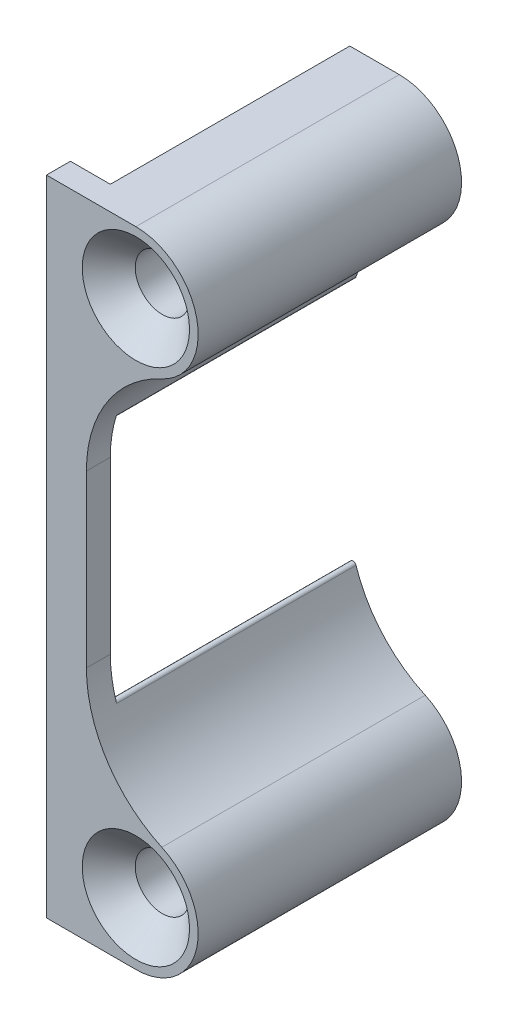
ISO-10303-21;
HEADER;
FILE_DESCRIPTION(('STEP AP214'),'2;1');
FILE_NAME('part.step','',(''),(''),'','','');
FILE_SCHEMA(('AUTOMOTIVE_DESIGN { 1 0 10303 214 1 1 1 1 }'));
ENDSEC;
DATA;
#1=APPLICATION_CONTEXT('core data for automotive mechanical design processes');
#2=APPLICATION_PROTOCOL_DEFINITION('international standard','automotive_design',2000,#1);
#3=PRODUCT_CONTEXT('',#1,'mechanical');
#4=PRODUCT('Part','Part','',(#3));
#5=PRODUCT_RELATED_PRODUCT_CATEGORY('part','',(#4));
#6=PRODUCT_DEFINITION_FORMATION('','',#4);
#7=PRODUCT_DEFINITION_CONTEXT('part definition',#1,'design');
#8=PRODUCT_DEFINITION('design','',#6,#7);
#9=PRODUCT_DEFINITION_SHAPE('','',#8);
#10=(LENGTH_UNIT() NAMED_UNIT(*) SI_UNIT(.MILLI.,.METRE.));
#11=(NAMED_UNIT(*) PLANE_ANGLE_UNIT() SI_UNIT($,.RADIAN.));
#12=(NAMED_UNIT(*) SI_UNIT($,.STERADIAN.) SOLID_ANGLE_UNIT());
#13=UNCERTAINTY_MEASURE_WITH_UNIT(LENGTH_MEASURE(1.E-05),#10,'distance_accuracy_value','');
#14=(GEOMETRIC_REPRESENTATION_CONTEXT(3) GLOBAL_UNCERTAINTY_ASSIGNED_CONTEXT((#13)) GLOBAL_UNIT_ASSIGNED_CONTEXT((#10,
#11,#12)) REPRESENTATION_CONTEXT('',''));
#15=CARTESIAN_POINT('',(0.,0.,0.));
#16=DIRECTION('',(0.,0.,1.));
#17=DIRECTION('',(1.,0.,0.));
#18=AXIS2_PLACEMENT_3D('',#15,#16,#17);
#19=CARTESIAN_POINT('',(0.,0.,0.));
#20=DIRECTION('',(0.,0.,-1.));
#21=DIRECTION('',(-1.,0.,0.));
#22=AXIS2_PLACEMENT_3D('',#19,#20,#21);
#23=PLANE('',#22);
#24=DIRECTION('',(0.,1.,0.));
#25=VECTOR('',#24,1.);
#26=CARTESIAN_POINT('',(154.9,14.9087121146357,0.));
#27=LINE('',#26,#25);
#28=CARTESIAN_POINT('',(154.9,14.9087121146357,0.));
#29=VERTEX_POINT('',#28);
#30=CARTESIAN_POINT('',(154.9,25.5912878853642,0.));
#31=VERTEX_POINT('',#30);
#32=EDGE_CURVE('E247',#29,#31,#27,.T.);
#33=ORIENTED_EDGE('',*,*,#32,.F.);
#34=CARTESIAN_POINT('',(163.,14.9087121146357,0.));
#35=DIRECTION('',(0.,0.,-1.));
#36=DIRECTION('',(-1.,0.,0.));
#37=AXIS2_PLACEMENT_3D('',#34,#35,#36);
#38=CIRCLE('',#37,8.1);
#39=CARTESIAN_POINT('',(155.290361445783,12.4244670857924,0.));
#40=VERTEX_POINT('',#39);
#41=EDGE_CURVE('E254',#40,#29,#38,.T.);
#42=ORIENTED_EDGE('',*,*,#41,.F.);
#43=CARTESIAN_POINT('',(155.1,12.3631277023641,0.));
#44=DIRECTION('',(0.,0.,-1.));
#45=DIRECTION('',(-1.,0.,0.));
#46=AXIS2_PLACEMENT_3D('',#43,#44,#45);
#47=CIRCLE('',#46,0.2);
#48=CARTESIAN_POINT('',(154.9,12.3631277023641,0.));
#49=VERTEX_POINT('',#48);
#50=EDGE_CURVE('E46',#40,#49,#47,.F.);
#51=ORIENTED_EDGE('',*,*,#50,.T.);
#52=DIRECTION('',(0.,1.,0.));
#53=VECTOR('',#52,1.);
#54=CARTESIAN_POINT('',(154.9,0.1,0.));
#55=LINE('',#54,#53);
#56=CARTESIAN_POINT('',(154.9,0.1,0.));
#57=VERTEX_POINT('',#56);
#58=EDGE_CURVE('E149',#57,#49,#55,.T.);
#59=ORIENTED_EDGE('',*,*,#58,.F.);
#60=DIRECTION('',(1.,0.,0.));
#61=VECTOR('',#60,1.);
#62=CARTESIAN_POINT('',(0.1,0.1,0.));
#63=LINE('',#62,#61);
#64=CARTESIAN_POINT('',(152.4,0.1,0.));
#65=VERTEX_POINT('',#64);
#66=EDGE_CURVE('E161',#65,#57,#63,.T.);
#67=ORIENTED_EDGE('',*,*,#66,.F.);
#68=DIRECTION('',(0.,-1.,0.));
#69=VECTOR('',#68,1.);
#70=CARTESIAN_POINT('',(152.4,40.4,0.));
#71=LINE('',#70,#69);
#72=CARTESIAN_POINT('',(152.4,40.4,0.));
#73=VERTEX_POINT('',#72);
#74=EDGE_CURVE('E298',#73,#65,#71,.T.);
#75=ORIENTED_EDGE('',*,*,#74,.F.);
#76=DIRECTION('',(-1.,0.,0.));
#77=VECTOR('',#76,1.);
#78=CARTESIAN_POINT('',(158.,40.4,0.));
#79=LINE('',#78,#77);
#80=CARTESIAN_POINT('',(154.9,40.4,0.));
#81=VERTEX_POINT('',#80);
#82=EDGE_CURVE('E262',#81,#73,#79,.T.);
#83=ORIENTED_EDGE('',*,*,#82,.F.);
#84=DIRECTION('',(0.,1.,0.));
#85=VECTOR('',#84,1.);
#86=CARTESIAN_POINT('',(154.9,40.4,0.));
#87=LINE('',#86,#85);
#88=CARTESIAN_POINT('',(154.9,28.1368722976358,0.));
#89=VERTEX_POINT('',#88);
#90=EDGE_CURVE('E178',#89,#81,#87,.T.);
#91=ORIENTED_EDGE('',*,*,#90,.F.);
#92=CARTESIAN_POINT('',(155.1,28.1368722976358,0.));
#93=DIRECTION('',(0.,0.,-1.));
#94=DIRECTION('',(-1.,0.,0.));
#95=AXIS2_PLACEMENT_3D('',#92,#93,#94);
#96=CIRCLE('',#95,0.2);
#97=CARTESIAN_POINT('',(155.290361445783,28.0755329142076,0.));
#98=VERTEX_POINT('',#97);
#99=EDGE_CURVE('E11',#89,#98,#96,.F.);
#100=ORIENTED_EDGE('',*,*,#99,.T.);
#101=CARTESIAN_POINT('',(163.,25.5912878853642,0.));
#102=DIRECTION('',(0.,0.,-1.));
#103=DIRECTION('',(-1.,0.,0.));
#104=AXIS2_PLACEMENT_3D('',#101,#102,#103);
#105=CIRCLE('',#104,8.1);
#106=EDGE_CURVE('E53',#31,#98,#105,.T.);
#107=ORIENTED_EDGE('',*,*,#106,.F.);
#108=EDGE_LOOP('',(#33,#42,#51,#59,#67,#75,#83,#91,#100,#107));
#109=FACE_BOUND('',#108,.T.);
#110=ADVANCED_FACE('F37',(#109),#23,.T.);
#111=CARTESIAN_POINT('',(158.,4.,0.));
#112=DIRECTION('',(0.,0.,1.));
#113=DIRECTION('',(1.,0.,0.));
#114=AXIS2_PLACEMENT_3D('',#111,#112,#113);
#115=CYLINDRICAL_SURFACE('',#114,3.9);
#116=CARTESIAN_POINT('',(158.,4.,1.5));
#117=DIRECTION('',(0.,0.,1.));
#118=DIRECTION('',(1.,0.,0.));
#119=AXIS2_PLACEMENT_3D('',#116,#117,#118);
#120=CIRCLE('',#119,3.9);
#121=CARTESIAN_POINT('',(158.,0.0999999999999998,1.5));
#122=VERTEX_POINT('',#121);
#123=CARTESIAN_POINT('',(159.625,7.5453314372566,1.5));
#124=VERTEX_POINT('',#123);
#125=EDGE_CURVE('E272',#122,#124,#120,.T.);
#126=ORIENTED_EDGE('',*,*,#125,.F.);
#127=DIRECTION('',(0.,0.,1.));
#128=VECTOR('',#127,1.);
#129=CARTESIAN_POINT('',(158.,0.0999999999999998,0.));
#130=LINE('',#129,#128);
#131=CARTESIAN_POINT('',(158.,0.0999999999999985,-15.));
#132=VERTEX_POINT('',#131);
#133=EDGE_CURVE('E165',#132,#122,#130,.T.);
#134=ORIENTED_EDGE('',*,*,#133,.F.);
#135=CARTESIAN_POINT('',(158.,4.,-15.));
#136=DIRECTION('',(0.,0.,-1.));
#137=DIRECTION('',(-1.,0.,0.));
#138=AXIS2_PLACEMENT_3D('',#135,#136,#137);
#139=CIRCLE('',#138,3.9);
#140=CARTESIAN_POINT('',(159.625,7.5453314372566,-15.));
#141=VERTEX_POINT('',#140);
#142=EDGE_CURVE('E142',#141,#132,#139,.T.);
#143=ORIENTED_EDGE('',*,*,#142,.F.);
#144=DIRECTION('',(0.,0.,1.));
#145=VECTOR('',#144,1.);
#146=CARTESIAN_POINT('',(159.625,7.54533143725661,0.));
#147=LINE('',#146,#145);
#148=EDGE_CURVE('E152',#141,#124,#147,.T.);
#149=ORIENTED_EDGE('',*,*,#148,.T.);
#150=EDGE_LOOP('',(#126,#134,#143,#149));
#151=FACE_BOUND('',#150,.T.);
#152=ADVANCED_FACE('F163',(#151),#115,.T.);
#153=CARTESIAN_POINT('',(0.1,0.1,0.));
#154=DIRECTION('',(0.,-1.,0.));
#155=DIRECTION('',(1.,0.,0.));
#156=AXIS2_PLACEMENT_3D('',#153,#154,#155);
#157=PLANE('',#156);
#158=DIRECTION('',(0.,0.,-1.));
#159=VECTOR('',#158,1.);
#160=CARTESIAN_POINT('',(152.4,0.1,1.5));
#161=LINE('',#160,#159);
#162=CARTESIAN_POINT('',(152.4,0.0999999999999998,1.5));
#163=VERTEX_POINT('',#162);
#164=EDGE_CURVE('E274',#163,#65,#161,.T.);
#165=ORIENTED_EDGE('',*,*,#164,.T.);
#166=ORIENTED_EDGE('',*,*,#66,.T.);
#167=DIRECTION('',(0.,0.,1.));
#168=VECTOR('',#167,1.);
#169=CARTESIAN_POINT('',(154.9,0.1,-15.));
#170=LINE('',#169,#168);
#171=CARTESIAN_POINT('',(154.9,0.1,-15.));
#172=VERTEX_POINT('',#171);
#173=EDGE_CURVE('E173',#172,#57,#170,.T.);
#174=ORIENTED_EDGE('',*,*,#173,.F.);
#175=DIRECTION('',(-1.,0.,0.));
#176=VECTOR('',#175,1.);
#177=CARTESIAN_POINT('',(158.,0.0999999999999985,-15.));
#178=LINE('',#177,#176);
#179=EDGE_CURVE('E166',#132,#172,#178,.T.);
#180=ORIENTED_EDGE('',*,*,#179,.F.);
#181=ORIENTED_EDGE('',*,*,#133,.T.);
#182=DIRECTION('',(1.,0.,0.));
#183=VECTOR('',#182,1.);
#184=CARTESIAN_POINT('',(0.1,0.1,1.5));
#185=LINE('',#184,#183);
#186=EDGE_CURVE('E245',#163,#122,#185,.T.);
#187=ORIENTED_EDGE('',*,*,#186,.F.);
#188=EDGE_LOOP('',(#165,#166,#174,#180,#181,#187));
#189=FACE_BOUND('',#188,.T.);
#190=ADVANCED_FACE('F309',(#189),#157,.T.);
#191=CARTESIAN_POINT('',(158.,40.4,0.));
#192=DIRECTION('',(0.,1.,0.));
#193=DIRECTION('',(-1.,0.,0.));
#194=AXIS2_PLACEMENT_3D('',#191,#192,#193);
#195=PLANE('',#194);
#196=DIRECTION('',(0.,0.,-1.));
#197=VECTOR('',#196,1.);
#198=CARTESIAN_POINT('',(152.4,40.4,1.5));
#199=LINE('',#198,#197);
#200=CARTESIAN_POINT('',(152.4,40.4,1.5));
#201=VERTEX_POINT('',#200);
#202=EDGE_CURVE('E303',#201,#73,#199,.T.);
#203=ORIENTED_EDGE('',*,*,#202,.F.);
#204=DIRECTION('',(-1.,0.,0.));
#205=VECTOR('',#204,1.);
#206=CARTESIAN_POINT('',(158.,40.4,1.5));
#207=LINE('',#206,#205);
#208=CARTESIAN_POINT('',(158.,40.4,1.5));
#209=VERTEX_POINT('',#208);
#210=EDGE_CURVE('E238',#209,#201,#207,.T.);
#211=ORIENTED_EDGE('',*,*,#210,.F.);
#212=DIRECTION('',(0.,0.,1.));
#213=VECTOR('',#212,1.);
#214=CARTESIAN_POINT('',(158.,40.4,0.));
#215=LINE('',#214,#213);
#216=CARTESIAN_POINT('',(158.,40.4,-15.));
#217=VERTEX_POINT('',#216);
#218=EDGE_CURVE('E255',#217,#209,#215,.T.);
#219=ORIENTED_EDGE('',*,*,#218,.F.);
#220=DIRECTION('',(1.,0.,0.));
#221=VECTOR('',#220,1.);
#222=CARTESIAN_POINT('',(154.9,40.4,-15.));
#223=LINE('',#222,#221);
#224=CARTESIAN_POINT('',(154.9,40.4,-15.));
#225=VERTEX_POINT('',#224);
#226=EDGE_CURVE('E184',#225,#217,#223,.T.);
#227=ORIENTED_EDGE('',*,*,#226,.F.);
#228=DIRECTION('',(0.,0.,1.));
#229=VECTOR('',#228,1.);
#230=CARTESIAN_POINT('',(154.9,40.4,-15.));
#231=LINE('',#230,#229);
#232=EDGE_CURVE('E190',#225,#81,#231,.T.);
#233=ORIENTED_EDGE('',*,*,#232,.T.);
#234=ORIENTED_EDGE('',*,*,#82,.T.);
#235=EDGE_LOOP('',(#203,#211,#219,#227,#233,#234));
#236=FACE_BOUND('',#235,.T.);
#237=ADVANCED_FACE('F287',(#236),#195,.T.);
#238=CARTESIAN_POINT('',(158.,36.5,0.));
#239=DIRECTION('',(0.,0.,1.));
#240=DIRECTION('',(1.,0.,0.));
#241=AXIS2_PLACEMENT_3D('',#238,#239,#240);
#242=CYLINDRICAL_SURFACE('',#241,3.90000000000002);
#243=CARTESIAN_POINT('',(158.,36.5,1.5));
#244=DIRECTION('',(0.,0.,1.));
#245=DIRECTION('',(1.,0.,0.));
#246=AXIS2_PLACEMENT_3D('',#243,#244,#245);
#247=CIRCLE('',#246,3.90000000000002);
#248=CARTESIAN_POINT('',(159.625,32.9546685627433,1.5));
#249=VERTEX_POINT('',#248);
#250=EDGE_CURVE('E242',#249,#209,#247,.T.);
#251=ORIENTED_EDGE('',*,*,#250,.F.);
#252=DIRECTION('',(0.,0.,1.));
#253=VECTOR('',#252,1.);
#254=CARTESIAN_POINT('',(159.625,32.9546685627433,0.));
#255=LINE('',#254,#253);
#256=CARTESIAN_POINT('',(159.625,32.9546685627433,-15.));
#257=VERTEX_POINT('',#256);
#258=EDGE_CURVE('E257',#257,#249,#255,.T.);
#259=ORIENTED_EDGE('',*,*,#258,.F.);
#260=CARTESIAN_POINT('',(158.,36.5,-15.));
#261=DIRECTION('',(0.,0.,-1.));
#262=DIRECTION('',(-1.,0.,0.));
#263=AXIS2_PLACEMENT_3D('',#260,#261,#262);
#264=CIRCLE('',#263,3.90000000000003);
#265=EDGE_CURVE('E187',#217,#257,#264,.T.);
#266=ORIENTED_EDGE('',*,*,#265,.F.);
#267=ORIENTED_EDGE('',*,*,#218,.T.);
#268=EDGE_LOOP('',(#251,#259,#266,#267));
#269=FACE_BOUND('',#268,.T.);
#270=ADVANCED_FACE('F285',(#269),#242,.T.);
#271=CARTESIAN_POINT('',(163.,25.5912878853642,0.));
#272=DIRECTION('',(0.,0.,1.));
#273=DIRECTION('',(1.,0.,0.));
#274=AXIS2_PLACEMENT_3D('',#271,#272,#273);
#275=CYLINDRICAL_SURFACE('',#274,8.1);
#276=DIRECTION('',(0.,0.,1.));
#277=VECTOR('',#276,1.);
#278=CARTESIAN_POINT('',(154.9,25.5912878853642,0.));
#279=LINE('',#278,#277);
#280=CARTESIAN_POINT('',(154.9,25.5912878853642,1.5));
#281=VERTEX_POINT('',#280);
#282=EDGE_CURVE('E259',#31,#281,#279,.T.);
#283=ORIENTED_EDGE('',*,*,#282,.F.);
#284=ORIENTED_EDGE('',*,*,#106,.T.);
#285=DIRECTION('',(0.,0.,1.));
#286=VECTOR('',#285,1.);
#287=CARTESIAN_POINT('',(155.290361445783,28.0755329142076,0.));
#288=LINE('',#287,#286);
#289=CARTESIAN_POINT('',(155.290361445783,28.0755329142076,-15.));
#290=VERTEX_POINT('',#289);
#291=EDGE_CURVE('E202',#98,#290,#288,.F.);
#292=ORIENTED_EDGE('',*,*,#291,.T.);
#293=CARTESIAN_POINT('',(163.,25.5912878853642,-15.));
#294=DIRECTION('',(0.,0.,1.));
#295=DIRECTION('',(-1.,0.,0.));
#296=AXIS2_PLACEMENT_3D('',#293,#294,#295);
#297=CIRCLE('',#296,8.1);
#298=EDGE_CURVE('E179',#257,#290,#297,.T.);
#299=ORIENTED_EDGE('',*,*,#298,.F.);
#300=ORIENTED_EDGE('',*,*,#258,.T.);
#301=CARTESIAN_POINT('',(163.,25.5912878853642,1.5));
#302=DIRECTION('',(0.,0.,-1.));
#303=DIRECTION('',(1.,0.,0.));
#304=AXIS2_PLACEMENT_3D('',#301,#302,#303);
#305=CIRCLE('',#304,8.1);
#306=EDGE_CURVE('E249',#281,#249,#305,.T.);
#307=ORIENTED_EDGE('',*,*,#306,.F.);
#308=EDGE_LOOP('',(#283,#284,#292,#299,#300,#307));
#309=FACE_BOUND('',#308,.T.);
#310=ADVANCED_FACE('F280',(#309),#275,.F.);
#311=CARTESIAN_POINT('',(154.9,14.9087121146357,0.));
#312=DIRECTION('',(1.,0.,0.));
#313=DIRECTION('',(0.,0.,-1.));
#314=AXIS2_PLACEMENT_3D('',#311,#312,#313);
#315=PLANE('',#314);
#316=DIRECTION('',(0.,1.,0.));
#317=VECTOR('',#316,1.);
#318=CARTESIAN_POINT('',(154.9,14.9087121146357,1.5));
#319=LINE('',#318,#317);
#320=CARTESIAN_POINT('',(154.9,14.9087121146357,1.5));
#321=VERTEX_POINT('',#320);
#322=EDGE_CURVE('E276',#321,#281,#319,.T.);
#323=ORIENTED_EDGE('',*,*,#322,.F.);
#324=DIRECTION('',(0.,0.,1.));
#325=VECTOR('',#324,1.);
#326=CARTESIAN_POINT('',(154.9,14.9087121146357,0.));
#327=LINE('',#326,#325);
#328=EDGE_CURVE('E160',#29,#321,#327,.T.);
#329=ORIENTED_EDGE('',*,*,#328,.F.);
#330=ORIENTED_EDGE('',*,*,#32,.T.);
#331=ORIENTED_EDGE('',*,*,#282,.T.);
#332=EDGE_LOOP('',(#323,#329,#330,#331));
#333=FACE_BOUND('',#332,.T.);
#334=ADVANCED_FACE('F323',(#333),#315,.T.);
#335=CARTESIAN_POINT('',(163.,14.9087121146357,0.));
#336=DIRECTION('',(0.,0.,1.));
#337=DIRECTION('',(1.,0.,0.));
#338=AXIS2_PLACEMENT_3D('',#335,#336,#337);
#339=CYLINDRICAL_SURFACE('',#338,8.1);
#340=CARTESIAN_POINT('',(163.,14.9087121146357,-15.));
#341=DIRECTION('',(0.,0.,1.));
#342=DIRECTION('',(-1.,0.,0.));
#343=AXIS2_PLACEMENT_3D('',#340,#341,#342);
#344=CIRCLE('',#343,8.1);
#345=CARTESIAN_POINT('',(155.290361445783,12.4244670857924,-15.));
#346=VERTEX_POINT('',#345);
#347=EDGE_CURVE('E137',#346,#141,#344,.T.);
#348=ORIENTED_EDGE('',*,*,#347,.F.);
#349=DIRECTION('',(0.,0.,1.));
#350=VECTOR('',#349,1.);
#351=CARTESIAN_POINT('',(155.290361445783,12.4244670857924,0.));
#352=LINE('',#351,#350);
#353=EDGE_CURVE('E316',#346,#40,#352,.T.);
#354=ORIENTED_EDGE('',*,*,#353,.T.);
#355=ORIENTED_EDGE('',*,*,#41,.T.);
#356=ORIENTED_EDGE('',*,*,#328,.T.);
#357=CARTESIAN_POINT('',(163.,14.9087121146357,1.5));
#358=DIRECTION('',(0.,0.,-1.));
#359=DIRECTION('',(1.,0.,0.));
#360=AXIS2_PLACEMENT_3D('',#357,#358,#359);
#361=CIRCLE('',#360,8.1);
#362=EDGE_CURVE('E156',#124,#321,#361,.T.);
#363=ORIENTED_EDGE('',*,*,#362,.F.);
#364=ORIENTED_EDGE('',*,*,#148,.F.);
#365=EDGE_LOOP('',(#348,#354,#355,#356,#363,#364));
#366=FACE_BOUND('',#365,.T.);
#367=ADVANCED_FACE('F153',(#366),#339,.F.);
#368=CARTESIAN_POINT('',(0.,0.,1.5));
#369=DIRECTION('',(0.,0.,-1.));
#370=DIRECTION('',(-1.,0.,0.));
#371=AXIS2_PLACEMENT_3D('',#368,#369,#370);
#372=PLANE('',#371);
#373=CARTESIAN_POINT('',(158.,36.5,1.5));
#374=DIRECTION('',(0.,0.,1.));
#375=DIRECTION('',(1.,0.,0.));
#376=AXIS2_PLACEMENT_3D('',#373,#374,#375);
#377=CIRCLE('',#376,3.36);
#378=CARTESIAN_POINT('',(161.36,36.5,1.5));
#379=VERTEX_POINT('',#378);
#380=EDGE_CURVE('E221',#379,#379,#377,.T.);
#381=ORIENTED_EDGE('',*,*,#380,.F.);
#382=EDGE_LOOP('',(#381));
#383=FACE_BOUND('',#382,.T.);
#384=CARTESIAN_POINT('',(158.,4.,1.5));
#385=DIRECTION('',(0.,0.,1.));
#386=DIRECTION('',(1.,0.,0.));
#387=AXIS2_PLACEMENT_3D('',#384,#385,#386);
#388=CIRCLE('',#387,3.36);
#389=CARTESIAN_POINT('',(161.36,4.,1.5));
#390=VERTEX_POINT('',#389);
#391=EDGE_CURVE('E212',#390,#390,#388,.T.);
#392=ORIENTED_EDGE('',*,*,#391,.F.);
#393=EDGE_LOOP('',(#392));
#394=FACE_BOUND('',#393,.T.);
#395=ORIENTED_EDGE('',*,*,#210,.T.);
#396=DIRECTION('',(0.,-1.,0.));
#397=VECTOR('',#396,1.);
#398=CARTESIAN_POINT('',(152.4,40.4,1.5));
#399=LINE('',#398,#397);
#400=EDGE_CURVE('E193',#201,#163,#399,.T.);
#401=ORIENTED_EDGE('',*,*,#400,.T.);
#402=ORIENTED_EDGE('',*,*,#186,.T.);
#403=ORIENTED_EDGE('',*,*,#125,.T.);
#404=ORIENTED_EDGE('',*,*,#362,.T.);
#405=ORIENTED_EDGE('',*,*,#322,.T.);
#406=ORIENTED_EDGE('',*,*,#306,.T.);
#407=ORIENTED_EDGE('',*,*,#250,.T.);
#408=EDGE_LOOP('',(#395,#401,#402,#403,#404,#405,#406,#407));
#409=FACE_BOUND('',#408,.T.);
#410=ADVANCED_FACE('F227',(#383,#394,#409),#372,.F.);
#411=CARTESIAN_POINT('',(152.4,40.4,1.5));
#412=DIRECTION('',(1.,0.,0.));
#413=DIRECTION('',(0.,0.,-1.));
#414=AXIS2_PLACEMENT_3D('',#411,#412,#413);
#415=PLANE('',#414);
#416=ORIENTED_EDGE('',*,*,#74,.T.);
#417=ORIENTED_EDGE('',*,*,#164,.F.);
#418=ORIENTED_EDGE('',*,*,#400,.F.);
#419=ORIENTED_EDGE('',*,*,#202,.T.);
#420=EDGE_LOOP('',(#416,#417,#418,#419));
#421=FACE_BOUND('',#420,.T.);
#422=ADVANCED_FACE('F230',(#421),#415,.F.);
#423=CARTESIAN_POINT('',(154.9,40.4,-15.));
#424=DIRECTION('',(1.,0.,0.));
#425=DIRECTION('',(0.,0.,-1.));
#426=AXIS2_PLACEMENT_3D('',#423,#424,#425);
#427=PLANE('',#426);
#428=DIRECTION('',(0.,1.,0.));
#429=VECTOR('',#428,1.);
#430=CARTESIAN_POINT('',(154.9,40.4,-15.));
#431=LINE('',#430,#429);
#432=CARTESIAN_POINT('',(154.9,28.1368722976358,-15.));
#433=VERTEX_POINT('',#432);
#434=EDGE_CURVE('E182',#433,#225,#431,.T.);
#435=ORIENTED_EDGE('',*,*,#434,.F.);
#436=DIRECTION('',(0.,0.,-1.));
#437=VECTOR('',#436,1.);
#438=CARTESIAN_POINT('',(154.9,28.1368722976358,0.));
#439=LINE('',#438,#437);
#440=EDGE_CURVE('E199',#433,#89,#439,.F.);
#441=ORIENTED_EDGE('',*,*,#440,.T.);
#442=ORIENTED_EDGE('',*,*,#90,.T.);
#443=ORIENTED_EDGE('',*,*,#232,.F.);
#444=EDGE_LOOP('',(#435,#441,#442,#443));
#445=FACE_BOUND('',#444,.T.);
#446=ADVANCED_FACE('F296',(#445),#427,.F.);
#447=CARTESIAN_POINT('',(163.,25.5912878853642,-15.));
#448=DIRECTION('',(0.,0.,-1.));
#449=DIRECTION('',(-1.,0.,0.));
#450=AXIS2_PLACEMENT_3D('',#447,#448,#449);
#451=PLANE('',#450);
#452=CARTESIAN_POINT('',(158.,36.5,-15.));
#453=DIRECTION('',(0.,0.,-1.));
#454=DIRECTION('',(-1.,0.,0.));
#455=AXIS2_PLACEMENT_3D('',#452,#453,#454);
#456=CIRCLE('',#455,1.70000000000001);
#457=CARTESIAN_POINT('',(156.3,36.5,-15.));
#458=VERTEX_POINT('',#457);
#459=EDGE_CURVE('E41',#458,#458,#456,.T.);
#460=ORIENTED_EDGE('',*,*,#459,.F.);
#461=EDGE_LOOP('',(#460));
#462=FACE_BOUND('',#461,.T.);
#463=ORIENTED_EDGE('',*,*,#298,.T.);
#464=CARTESIAN_POINT('',(155.1,28.1368722976358,-15.));
#465=DIRECTION('',(0.,0.,-1.));
#466=DIRECTION('',(-1.,0.,0.));
#467=AXIS2_PLACEMENT_3D('',#464,#465,#466);
#468=CIRCLE('',#467,0.2);
#469=EDGE_CURVE('E205',#290,#433,#468,.T.);
#470=ORIENTED_EDGE('',*,*,#469,.T.);
#471=ORIENTED_EDGE('',*,*,#434,.T.);
#472=ORIENTED_EDGE('',*,*,#226,.T.);
#473=ORIENTED_EDGE('',*,*,#265,.T.);
#474=EDGE_LOOP('',(#463,#470,#471,#472,#473));
#475=FACE_BOUND('',#474,.T.);
#476=ADVANCED_FACE('F290',(#462,#475),#451,.T.);
#477=CARTESIAN_POINT('',(154.9,0.1,-15.));
#478=DIRECTION('',(1.,0.,0.));
#479=DIRECTION('',(0.,0.,-1.));
#480=AXIS2_PLACEMENT_3D('',#477,#478,#479);
#481=PLANE('',#480);
#482=ORIENTED_EDGE('',*,*,#58,.T.);
#483=DIRECTION('',(0.,0.,-1.));
#484=VECTOR('',#483,1.);
#485=CARTESIAN_POINT('',(154.9,12.3631277023641,-15.));
#486=LINE('',#485,#484);
#487=CARTESIAN_POINT('',(154.9,12.3631277023641,-15.));
#488=VERTEX_POINT('',#487);
#489=EDGE_CURVE('E315',#49,#488,#486,.T.);
#490=ORIENTED_EDGE('',*,*,#489,.T.);
#491=DIRECTION('',(0.,1.,0.));
#492=VECTOR('',#491,1.);
#493=CARTESIAN_POINT('',(154.9,0.1,-15.));
#494=LINE('',#493,#492);
#495=EDGE_CURVE('E168',#172,#488,#494,.T.);
#496=ORIENTED_EDGE('',*,*,#495,.F.);
#497=ORIENTED_EDGE('',*,*,#173,.T.);
#498=EDGE_LOOP('',(#482,#490,#496,#497));
#499=FACE_BOUND('',#498,.T.);
#500=ADVANCED_FACE('F345',(#499),#481,.F.);
#501=CARTESIAN_POINT('',(163.,14.9087121146357,-15.));
#502=DIRECTION('',(0.,0.,-1.));
#503=DIRECTION('',(-1.,0.,0.));
#504=AXIS2_PLACEMENT_3D('',#501,#502,#503);
#505=PLANE('',#504);
#506=CARTESIAN_POINT('',(158.,4.,-15.));
#507=DIRECTION('',(0.,0.,-1.));
#508=DIRECTION('',(-1.,0.,0.));
#509=AXIS2_PLACEMENT_3D('',#506,#507,#508);
#510=CIRCLE('',#509,1.70000000000001);
#511=CARTESIAN_POINT('',(156.3,4.,-15.));
#512=VERTEX_POINT('',#511);
#513=EDGE_CURVE('E176',#512,#512,#510,.T.);
#514=ORIENTED_EDGE('',*,*,#513,.F.);
#515=EDGE_LOOP('',(#514));
#516=FACE_BOUND('',#515,.T.);
#517=ORIENTED_EDGE('',*,*,#495,.T.);
#518=CARTESIAN_POINT('',(155.1,12.3631277023641,-15.));
#519=DIRECTION('',(0.,0.,-1.));
#520=DIRECTION('',(-1.,0.,0.));
#521=AXIS2_PLACEMENT_3D('',#518,#519,#520);
#522=CIRCLE('',#521,0.2);
#523=EDGE_CURVE('E145',#488,#346,#522,.T.);
#524=ORIENTED_EDGE('',*,*,#523,.T.);
#525=ORIENTED_EDGE('',*,*,#347,.T.);
#526=ORIENTED_EDGE('',*,*,#142,.T.);
#527=ORIENTED_EDGE('',*,*,#179,.T.);
#528=EDGE_LOOP('',(#517,#524,#525,#526,#527));
#529=FACE_BOUND('',#528,.T.);
#530=ADVANCED_FACE('F140',(#516,#529),#505,.T.);
#531=CARTESIAN_POINT('',(155.1,12.3631277023641,0.));
#532=DIRECTION('',(0.,0.,1.));
#533=DIRECTION('',(1.,0.,0.));
#534=AXIS2_PLACEMENT_3D('',#531,#532,#533);
#535=CYLINDRICAL_SURFACE('',#534,0.2);
#536=ORIENTED_EDGE('',*,*,#523,.F.);
#537=ORIENTED_EDGE('',*,*,#489,.F.);
#538=ORIENTED_EDGE('',*,*,#50,.F.);
#539=ORIENTED_EDGE('',*,*,#353,.F.);
#540=EDGE_LOOP('',(#536,#537,#538,#539));
#541=FACE_BOUND('',#540,.T.);
#542=ADVANCED_FACE('F314',(#541),#535,.T.);
#543=CARTESIAN_POINT('',(155.1,28.1368722976358,0.));
#544=DIRECTION('',(0.,0.,1.));
#545=DIRECTION('',(1.,0.,0.));
#546=AXIS2_PLACEMENT_3D('',#543,#544,#545);
#547=CYLINDRICAL_SURFACE('',#546,0.2);
#548=ORIENTED_EDGE('',*,*,#469,.F.);
#549=ORIENTED_EDGE('',*,*,#291,.F.);
#550=ORIENTED_EDGE('',*,*,#99,.F.);
#551=ORIENTED_EDGE('',*,*,#440,.F.);
#552=EDGE_LOOP('',(#548,#549,#550,#551));
#553=FACE_BOUND('',#552,.T.);
#554=ADVANCED_FACE('F39',(#553),#547,.T.);
#555=CARTESIAN_POINT('',(158.,4.,1.5));
#556=DIRECTION('',(0.,0.,1.));
#557=DIRECTION('',(1.,0.,0.));
#558=AXIS2_PLACEMENT_3D('',#555,#556,#557);
#559=CYLINDRICAL_SURFACE('',#558,1.70000000000001);
#560=ORIENTED_EDGE('',*,*,#513,.T.);
#561=EDGE_LOOP('',(#560));
#562=FACE_BOUND('',#561,.T.);
#563=CARTESIAN_POINT('',(158.,4.,-0.16));
#564=DIRECTION('',(0.,0.,1.));
#565=DIRECTION('',(1.,0.,0.));
#566=AXIS2_PLACEMENT_3D('',#563,#564,#565);
#567=CIRCLE('',#566,1.70000000000001);
#568=CARTESIAN_POINT('',(159.7,4.,-0.16));
#569=VERTEX_POINT('',#568);
#570=EDGE_CURVE('E208',#569,#569,#567,.T.);
#571=ORIENTED_EDGE('',*,*,#570,.T.);
#572=EDGE_LOOP('',(#571));
#573=FACE_BOUND('',#572,.T.);
#574=ADVANCED_FACE('F343',(#562,#573),#559,.F.);
#575=CARTESIAN_POINT('',(158.,4.,1.5));
#576=DIRECTION('',(0.,0.,1.));
#577=DIRECTION('',(1.,0.,0.));
#578=AXIS2_PLACEMENT_3D('',#575,#576,#577);
#579=CONICAL_SURFACE('',#578,3.36,0.785398163397447);
#580=ORIENTED_EDGE('',*,*,#570,.F.);
#581=EDGE_LOOP('',(#580));
#582=FACE_BOUND('',#581,.T.);
#583=ORIENTED_EDGE('',*,*,#391,.T.);
#584=EDGE_LOOP('',(#583));
#585=FACE_BOUND('',#584,.T.);
#586=ADVANCED_FACE('F434',(#582,#585),#579,.F.);
#587=CARTESIAN_POINT('',(158.,36.5,1.5));
#588=DIRECTION('',(0.,0.,1.));
#589=DIRECTION('',(1.,0.,0.));
#590=AXIS2_PLACEMENT_3D('',#587,#588,#589);
#591=CYLINDRICAL_SURFACE('',#590,1.70000000000001);
#592=ORIENTED_EDGE('',*,*,#459,.T.);
#593=EDGE_LOOP('',(#592));
#594=FACE_BOUND('',#593,.T.);
#595=CARTESIAN_POINT('',(158.,36.5,-0.16));
#596=DIRECTION('',(0.,0.,1.));
#597=DIRECTION('',(1.,0.,0.));
#598=AXIS2_PLACEMENT_3D('',#595,#596,#597);
#599=CIRCLE('',#598,1.70000000000001);
#600=CARTESIAN_POINT('',(159.7,36.5,-0.16));
#601=VERTEX_POINT('',#600);
#602=EDGE_CURVE('E218',#601,#601,#599,.T.);
#603=ORIENTED_EDGE('',*,*,#602,.T.);
#604=EDGE_LOOP('',(#603));
#605=FACE_BOUND('',#604,.T.);
#606=ADVANCED_FACE('F442',(#594,#605),#591,.F.);
#607=CARTESIAN_POINT('',(158.,36.5,1.5));
#608=DIRECTION('',(0.,0.,1.));
#609=DIRECTION('',(1.,0.,0.));
#610=AXIS2_PLACEMENT_3D('',#607,#608,#609);
#611=CONICAL_SURFACE('',#610,3.36,0.785398163397447);
#612=ORIENTED_EDGE('',*,*,#602,.F.);
#613=EDGE_LOOP('',(#612));
#614=FACE_BOUND('',#613,.T.);
#615=ORIENTED_EDGE('',*,*,#380,.T.);
#616=EDGE_LOOP('',(#615));
#617=FACE_BOUND('',#616,.T.);
#618=ADVANCED_FACE('F225',(#614,#617),#611,.F.);
#619=CLOSED_SHELL('',(#110,#152,#190,#237,#270,#310,#334,#367,#410,#422,#446,#476,#500,#530,
#542,#554,#574,#586,#606,#618));
#620=MANIFOLD_SOLID_BREP('B2',#619);
#621=ADVANCED_BREP_SHAPE_REPRESENTATION('',(#18,#620),#14);
#622=SHAPE_DEFINITION_REPRESENTATION(#9,#621);
ENDSEC;
END-ISO-10303-21;
